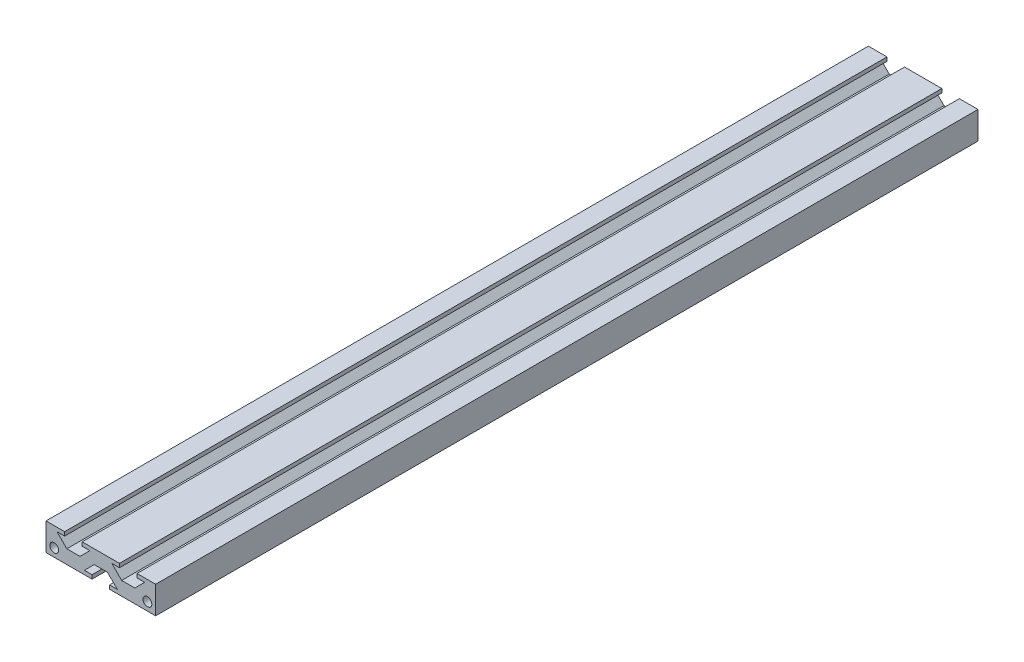
ISO-10303-21;
HEADER;
FILE_DESCRIPTION(('STEP AP214'),'2;1');
FILE_NAME('part.step','',(''),(''),'','','');
FILE_SCHEMA(('AUTOMOTIVE_DESIGN { 1 0 10303 214 1 1 1 1 }'));
ENDSEC;
DATA;
#1=APPLICATION_CONTEXT('core data for automotive mechanical design processes');
#2=APPLICATION_PROTOCOL_DEFINITION('international standard','automotive_design',2000,#1);
#3=PRODUCT_CONTEXT('',#1,'mechanical');
#4=PRODUCT('Part','Part','',(#3));
#5=PRODUCT_RELATED_PRODUCT_CATEGORY('part','',(#4));
#6=PRODUCT_DEFINITION_FORMATION('','',#4);
#7=PRODUCT_DEFINITION_CONTEXT('part definition',#1,'design');
#8=PRODUCT_DEFINITION('design','',#6,#7);
#9=PRODUCT_DEFINITION_SHAPE('','',#8);
#10=(LENGTH_UNIT() NAMED_UNIT(*) SI_UNIT(.MILLI.,.METRE.));
#11=(NAMED_UNIT(*) PLANE_ANGLE_UNIT() SI_UNIT($,.RADIAN.));
#12=(NAMED_UNIT(*) SI_UNIT($,.STERADIAN.) SOLID_ANGLE_UNIT());
#13=UNCERTAINTY_MEASURE_WITH_UNIT(LENGTH_MEASURE(1.E-05),#10,'distance_accuracy_value','');
#14=(GEOMETRIC_REPRESENTATION_CONTEXT(3) GLOBAL_UNCERTAINTY_ASSIGNED_CONTEXT((#13)) GLOBAL_UNIT_ASSIGNED_CONTEXT((#10,
#11,#12)) REPRESENTATION_CONTEXT('',''));
#15=CARTESIAN_POINT('',(0.,0.,0.));
#16=DIRECTION('',(0.,0.,1.));
#17=DIRECTION('',(1.,0.,0.));
#18=AXIS2_PLACEMENT_3D('',#15,#16,#17);
#19=CARTESIAN_POINT('',(0.,0.,300.));
#20=DIRECTION('',(0.,0.,1.));
#21=DIRECTION('',(1.,0.,0.));
#22=AXIS2_PLACEMENT_3D('',#19,#20,#21);
#23=PLANE('',#22);
#24=CARTESIAN_POINT('',(-17.,-2.,300.));
#25=DIRECTION('',(0.,0.,1.));
#26=DIRECTION('',(1.,0.,0.));
#27=AXIS2_PLACEMENT_3D('',#24,#25,#26);
#28=CIRCLE('',#27,1.6);
#29=CARTESIAN_POINT('',(-15.4,-2.,300.));
#30=VERTEX_POINT('',#29);
#31=EDGE_CURVE('E254',#30,#30,#28,.T.);
#32=ORIENTED_EDGE('',*,*,#31,.F.);
#33=EDGE_LOOP('',(#32));
#34=FACE_BOUND('',#33,.T.);
#35=DIRECTION('',(1.,0.,0.));
#36=VECTOR('',#35,1.);
#37=CARTESIAN_POINT('',(-3.20000000000001,-5.00000000000009,300.));
#38=LINE('',#37,#36);
#39=CARTESIAN_POINT('',(-20.,-5.,300.));
#40=VERTEX_POINT('',#39);
#41=CARTESIAN_POINT('',(-3.20000000000001,-5.00000000000009,300.));
#42=VERTEX_POINT('',#41);
#43=EDGE_CURVE('E305',#40,#42,#38,.T.);
#44=ORIENTED_EDGE('',*,*,#43,.T.);
#45=DIRECTION('',(0.,1.,0.));
#46=VECTOR('',#45,1.);
#47=CARTESIAN_POINT('',(-3.20000000000001,-3.60000000000005,300.));
#48=LINE('',#47,#46);
#49=CARTESIAN_POINT('',(-3.20000000000001,-3.60000000000005,300.));
#50=VERTEX_POINT('',#49);
#51=EDGE_CURVE('E153',#42,#50,#48,.T.);
#52=ORIENTED_EDGE('',*,*,#51,.T.);
#53=DIRECTION('',(-1.,0.,0.));
#54=VECTOR('',#53,1.);
#55=CARTESIAN_POINT('',(-6.00000000000008,-3.60000000000005,300.));
#56=LINE('',#55,#54);
#57=CARTESIAN_POINT('',(-6.00000000000008,-3.60000000000005,300.));
#58=VERTEX_POINT('',#57);
#59=EDGE_CURVE('E380',#50,#58,#56,.T.);
#60=ORIENTED_EDGE('',*,*,#59,.T.);
#61=DIRECTION('',(0.707106781186547,0.707106781186547,0.));
#62=VECTOR('',#61,1.);
#63=CARTESIAN_POINT('',(-2.40000000000002,0.,300.));
#64=LINE('',#63,#62);
#65=CARTESIAN_POINT('',(-2.40000000000002,0.,300.));
#66=VERTEX_POINT('',#65);
#67=EDGE_CURVE('E399',#58,#66,#64,.T.);
#68=ORIENTED_EDGE('',*,*,#67,.T.);
#69=DIRECTION('',(1.,0.,0.));
#70=VECTOR('',#69,1.);
#71=CARTESIAN_POINT('',(2.40000000000009,0.,300.));
#72=LINE('',#71,#70);
#73=CARTESIAN_POINT('',(2.40000000000009,0.,300.));
#74=VERTEX_POINT('',#73);
#75=EDGE_CURVE('E396',#66,#74,#72,.T.);
#76=ORIENTED_EDGE('',*,*,#75,.T.);
#77=DIRECTION('',(0.707106781186548,-0.707106781186548,0.));
#78=VECTOR('',#77,1.);
#79=CARTESIAN_POINT('',(6.0000000000001,-3.59999999999999,300.));
#80=LINE('',#79,#78);
#81=CARTESIAN_POINT('',(6.0000000000001,-3.59999999999999,300.));
#82=VERTEX_POINT('',#81);
#83=EDGE_CURVE('E398',#74,#82,#80,.T.);
#84=ORIENTED_EDGE('',*,*,#83,.T.);
#85=DIRECTION('',(-1.,0.,0.));
#86=VECTOR('',#85,1.);
#87=CARTESIAN_POINT('',(3.20000000000003,-3.59999999999999,300.));
#88=LINE('',#87,#86);
#89=CARTESIAN_POINT('',(3.20000000000003,-3.59999999999999,300.));
#90=VERTEX_POINT('',#89);
#91=EDGE_CURVE('E401',#82,#90,#88,.T.);
#92=ORIENTED_EDGE('',*,*,#91,.T.);
#93=DIRECTION('',(0.,-1.,0.));
#94=VECTOR('',#93,1.);
#95=CARTESIAN_POINT('',(3.20000000000003,-4.99999999999998,300.));
#96=LINE('',#95,#94);
#97=CARTESIAN_POINT('',(3.20000000000003,-4.99999999999998,300.));
#98=VERTEX_POINT('',#97);
#99=EDGE_CURVE('E407',#90,#98,#96,.T.);
#100=ORIENTED_EDGE('',*,*,#99,.T.);
#101=DIRECTION('',(1.,0.,0.));
#102=VECTOR('',#101,1.);
#103=CARTESIAN_POINT('',(20.,-5.,300.));
#104=LINE('',#103,#102);
#105=CARTESIAN_POINT('',(20.,-5.,300.));
#106=VERTEX_POINT('',#105);
#107=EDGE_CURVE('E409',#98,#106,#104,.T.);
#108=ORIENTED_EDGE('',*,*,#107,.T.);
#109=DIRECTION('',(0.,1.,0.));
#110=VECTOR('',#109,1.);
#111=CARTESIAN_POINT('',(20.,5.,300.));
#112=LINE('',#111,#110);
#113=CARTESIAN_POINT('',(20.,5.,300.));
#114=VERTEX_POINT('',#113);
#115=EDGE_CURVE('E411',#106,#114,#112,.T.);
#116=ORIENTED_EDGE('',*,*,#115,.T.);
#117=DIRECTION('',(-1.,0.,0.));
#118=VECTOR('',#117,1.);
#119=CARTESIAN_POINT('',(20.,5.,300.));
#120=LINE('',#119,#118);
#121=CARTESIAN_POINT('',(13.2,5.,300.));
#122=VERTEX_POINT('',#121);
#123=EDGE_CURVE('E413',#114,#122,#120,.T.);
#124=ORIENTED_EDGE('',*,*,#123,.T.);
#125=DIRECTION('',(0.,-1.,0.));
#126=VECTOR('',#125,1.);
#127=CARTESIAN_POINT('',(13.2,3.60000000000001,300.));
#128=LINE('',#127,#126);
#129=CARTESIAN_POINT('',(13.2,3.60000000000001,300.));
#130=VERTEX_POINT('',#129);
#131=EDGE_CURVE('E415',#122,#130,#128,.T.);
#132=ORIENTED_EDGE('',*,*,#131,.T.);
#133=DIRECTION('',(1.,0.,0.));
#134=VECTOR('',#133,1.);
#135=CARTESIAN_POINT('',(16.,3.6,300.));
#136=LINE('',#135,#134);
#137=CARTESIAN_POINT('',(16.,3.6,300.));
#138=VERTEX_POINT('',#137);
#139=EDGE_CURVE('E417',#130,#138,#136,.T.);
#140=ORIENTED_EDGE('',*,*,#139,.T.);
#141=DIRECTION('',(-0.707106781186543,-0.707106781186552,0.));
#142=VECTOR('',#141,1.);
#143=CARTESIAN_POINT('',(12.4,0.,300.));
#144=LINE('',#143,#142);
#145=CARTESIAN_POINT('',(12.4,0.,300.));
#146=VERTEX_POINT('',#145);
#147=EDGE_CURVE('E419',#138,#146,#144,.T.);
#148=ORIENTED_EDGE('',*,*,#147,.T.);
#149=DIRECTION('',(-1.,0.,0.));
#150=VECTOR('',#149,1.);
#151=CARTESIAN_POINT('',(7.59999999999999,0.,300.));
#152=LINE('',#151,#150);
#153=CARTESIAN_POINT('',(7.59999999999999,0.,300.));
#154=VERTEX_POINT('',#153);
#155=EDGE_CURVE('E421',#146,#154,#152,.T.);
#156=ORIENTED_EDGE('',*,*,#155,.T.);
#157=DIRECTION('',(-0.707106781186552,0.707106781186543,0.));
#158=VECTOR('',#157,1.);
#159=CARTESIAN_POINT('',(3.99999999999996,3.6,300.));
#160=LINE('',#159,#158);
#161=CARTESIAN_POINT('',(3.99999999999996,3.6,300.));
#162=VERTEX_POINT('',#161);
#163=EDGE_CURVE('E423',#154,#162,#160,.T.);
#164=ORIENTED_EDGE('',*,*,#163,.T.);
#165=DIRECTION('',(1.,0.,0.));
#166=VECTOR('',#165,1.);
#167=CARTESIAN_POINT('',(6.79999999999996,3.6,300.));
#168=LINE('',#167,#166);
#169=CARTESIAN_POINT('',(6.79999999999996,3.6,300.));
#170=VERTEX_POINT('',#169);
#171=EDGE_CURVE('E425',#162,#170,#168,.T.);
#172=ORIENTED_EDGE('',*,*,#171,.T.);
#173=DIRECTION('',(0.,1.,0.));
#174=VECTOR('',#173,1.);
#175=CARTESIAN_POINT('',(6.79999999999996,5.,300.));
#176=LINE('',#175,#174);
#177=CARTESIAN_POINT('',(6.79999999999996,5.,300.));
#178=VERTEX_POINT('',#177);
#179=EDGE_CURVE('E427',#170,#178,#176,.T.);
#180=ORIENTED_EDGE('',*,*,#179,.T.);
#181=DIRECTION('',(-1.,0.,0.));
#182=VECTOR('',#181,1.);
#183=CARTESIAN_POINT('',(6.79999999999996,5.,300.));
#184=LINE('',#183,#182);
#185=CARTESIAN_POINT('',(-6.80000000000005,5.,300.));
#186=VERTEX_POINT('',#185);
#187=EDGE_CURVE('E429',#178,#186,#184,.T.);
#188=ORIENTED_EDGE('',*,*,#187,.T.);
#189=DIRECTION('',(0.,-1.,0.));
#190=VECTOR('',#189,1.);
#191=CARTESIAN_POINT('',(-6.80000000000005,3.60000000000001,300.));
#192=LINE('',#191,#190);
#193=CARTESIAN_POINT('',(-6.80000000000005,3.60000000000001,300.));
#194=VERTEX_POINT('',#193);
#195=EDGE_CURVE('E431',#186,#194,#192,.T.);
#196=ORIENTED_EDGE('',*,*,#195,.T.);
#197=DIRECTION('',(1.,0.,0.));
#198=VECTOR('',#197,1.);
#199=CARTESIAN_POINT('',(-4.00000000000005,3.6,300.));
#200=LINE('',#199,#198);
#201=CARTESIAN_POINT('',(-4.00000000000005,3.6,300.));
#202=VERTEX_POINT('',#201);
#203=EDGE_CURVE('E433',#194,#202,#200,.T.);
#204=ORIENTED_EDGE('',*,*,#203,.T.);
#205=DIRECTION('',(-0.707106781186543,-0.707106781186552,0.));
#206=VECTOR('',#205,1.);
#207=CARTESIAN_POINT('',(-7.6,0.,300.));
#208=LINE('',#207,#206);
#209=CARTESIAN_POINT('',(-7.6,0.,300.));
#210=VERTEX_POINT('',#209);
#211=EDGE_CURVE('E435',#202,#210,#208,.T.);
#212=ORIENTED_EDGE('',*,*,#211,.T.);
#213=DIRECTION('',(-1.,0.,0.));
#214=VECTOR('',#213,1.);
#215=CARTESIAN_POINT('',(-12.4,0.,300.));
#216=LINE('',#215,#214);
#217=CARTESIAN_POINT('',(-12.4,0.,300.));
#218=VERTEX_POINT('',#217);
#219=EDGE_CURVE('E437',#210,#218,#216,.T.);
#220=ORIENTED_EDGE('',*,*,#219,.T.);
#221=DIRECTION('',(-0.707106781186551,0.707106781186544,0.));
#222=VECTOR('',#221,1.);
#223=CARTESIAN_POINT('',(-16.,3.6,300.));
#224=LINE('',#223,#222);
#225=CARTESIAN_POINT('',(-16.,3.6,300.));
#226=VERTEX_POINT('',#225);
#227=EDGE_CURVE('E439',#218,#226,#224,.T.);
#228=ORIENTED_EDGE('',*,*,#227,.T.);
#229=DIRECTION('',(1.,0.,0.));
#230=VECTOR('',#229,1.);
#231=CARTESIAN_POINT('',(-13.2,3.6,300.));
#232=LINE('',#231,#230);
#233=CARTESIAN_POINT('',(-13.2,3.6,300.));
#234=VERTEX_POINT('',#233);
#235=EDGE_CURVE('E232',#226,#234,#232,.T.);
#236=ORIENTED_EDGE('',*,*,#235,.T.);
#237=DIRECTION('',(0.,1.,0.));
#238=VECTOR('',#237,1.);
#239=CARTESIAN_POINT('',(-13.2,5.,300.));
#240=LINE('',#239,#238);
#241=CARTESIAN_POINT('',(-13.2,5.,300.));
#242=VERTEX_POINT('',#241);
#243=EDGE_CURVE('E226',#234,#242,#240,.T.);
#244=ORIENTED_EDGE('',*,*,#243,.T.);
#245=DIRECTION('',(-1.,0.,0.));
#246=VECTOR('',#245,1.);
#247=CARTESIAN_POINT('',(-13.2,5.,300.));
#248=LINE('',#247,#246);
#249=CARTESIAN_POINT('',(-20.,5.,300.));
#250=VERTEX_POINT('',#249);
#251=EDGE_CURVE('E230',#242,#250,#248,.T.);
#252=ORIENTED_EDGE('',*,*,#251,.T.);
#253=DIRECTION('',(0.,-1.,0.));
#254=VECTOR('',#253,1.);
#255=CARTESIAN_POINT('',(-20.,5.,300.));
#256=LINE('',#255,#254);
#257=EDGE_CURVE('E50',#250,#40,#256,.T.);
#258=ORIENTED_EDGE('',*,*,#257,.T.);
#259=EDGE_LOOP('',(#44,#52,#60,#68,#76,#84,#92,#100,#108,#116,#124,#132,#140,#148,#156,#164,
#172,#180,#188,#196,#204,#212,#220,#228,#236,#244,#252,#258));
#260=FACE_BOUND('',#259,.T.);
#261=CARTESIAN_POINT('',(17.,-2.,300.));
#262=DIRECTION('',(0.,0.,1.));
#263=DIRECTION('',(1.,0.,0.));
#264=AXIS2_PLACEMENT_3D('',#261,#262,#263);
#265=CIRCLE('',#264,1.60000000000001);
#266=CARTESIAN_POINT('',(18.6,-2.,300.));
#267=VERTEX_POINT('',#266);
#268=EDGE_CURVE('E481',#267,#267,#265,.T.);
#269=ORIENTED_EDGE('',*,*,#268,.F.);
#270=EDGE_LOOP('',(#269));
#271=FACE_BOUND('',#270,.T.);
#272=ADVANCED_FACE('F33',(#34,#260,#271),#23,.T.);
#273=CARTESIAN_POINT('',(0.,0.,0.));
#274=DIRECTION('',(0.,0.,1.));
#275=DIRECTION('',(1.,0.,0.));
#276=AXIS2_PLACEMENT_3D('',#273,#274,#275);
#277=PLANE('',#276);
#278=DIRECTION('',(1.,0.,0.));
#279=VECTOR('',#278,1.);
#280=CARTESIAN_POINT('',(-3.20000000000001,-5.00000000000009,0.));
#281=LINE('',#280,#279);
#282=CARTESIAN_POINT('',(-20.,-5.,0.));
#283=VERTEX_POINT('',#282);
#284=CARTESIAN_POINT('',(-3.20000000000001,-5.00000000000009,0.));
#285=VERTEX_POINT('',#284);
#286=EDGE_CURVE('E250',#283,#285,#281,.T.);
#287=ORIENTED_EDGE('',*,*,#286,.F.);
#288=DIRECTION('',(0.,-1.,0.));
#289=VECTOR('',#288,1.);
#290=CARTESIAN_POINT('',(-20.,5.,0.));
#291=LINE('',#290,#289);
#292=CARTESIAN_POINT('',(-20.,5.,0.));
#293=VERTEX_POINT('',#292);
#294=EDGE_CURVE('E145',#293,#283,#291,.T.);
#295=ORIENTED_EDGE('',*,*,#294,.F.);
#296=DIRECTION('',(-1.,0.,0.));
#297=VECTOR('',#296,1.);
#298=CARTESIAN_POINT('',(-13.2,5.,0.));
#299=LINE('',#298,#297);
#300=CARTESIAN_POINT('',(-13.2,5.,0.));
#301=VERTEX_POINT('',#300);
#302=EDGE_CURVE('E139',#301,#293,#299,.T.);
#303=ORIENTED_EDGE('',*,*,#302,.F.);
#304=DIRECTION('',(0.,1.,0.));
#305=VECTOR('',#304,1.);
#306=CARTESIAN_POINT('',(-13.2,5.,0.));
#307=LINE('',#306,#305);
#308=CARTESIAN_POINT('',(-13.2,3.6,0.));
#309=VERTEX_POINT('',#308);
#310=EDGE_CURVE('E240',#309,#301,#307,.T.);
#311=ORIENTED_EDGE('',*,*,#310,.F.);
#312=DIRECTION('',(1.,0.,0.));
#313=VECTOR('',#312,1.);
#314=CARTESIAN_POINT('',(-13.2,3.6,0.));
#315=LINE('',#314,#313);
#316=CARTESIAN_POINT('',(-16.,3.6,0.));
#317=VERTEX_POINT('',#316);
#318=EDGE_CURVE('E300',#317,#309,#315,.T.);
#319=ORIENTED_EDGE('',*,*,#318,.F.);
#320=DIRECTION('',(-0.707106781186551,0.707106781186544,0.));
#321=VECTOR('',#320,1.);
#322=CARTESIAN_POINT('',(-16.,3.6,0.));
#323=LINE('',#322,#321);
#324=CARTESIAN_POINT('',(-12.4,0.,0.));
#325=VERTEX_POINT('',#324);
#326=EDGE_CURVE('E298',#325,#317,#323,.T.);
#327=ORIENTED_EDGE('',*,*,#326,.F.);
#328=DIRECTION('',(-1.,0.,0.));
#329=VECTOR('',#328,1.);
#330=CARTESIAN_POINT('',(-12.4,0.,0.));
#331=LINE('',#330,#329);
#332=CARTESIAN_POINT('',(-7.6,0.,0.));
#333=VERTEX_POINT('',#332);
#334=EDGE_CURVE('E296',#333,#325,#331,.T.);
#335=ORIENTED_EDGE('',*,*,#334,.F.);
#336=DIRECTION('',(-0.707106781186543,-0.707106781186552,0.));
#337=VECTOR('',#336,1.);
#338=CARTESIAN_POINT('',(-7.6,0.,0.));
#339=LINE('',#338,#337);
#340=CARTESIAN_POINT('',(-4.00000000000005,3.6,0.));
#341=VERTEX_POINT('',#340);
#342=EDGE_CURVE('E294',#341,#333,#339,.T.);
#343=ORIENTED_EDGE('',*,*,#342,.F.);
#344=DIRECTION('',(1.,0.,0.));
#345=VECTOR('',#344,1.);
#346=CARTESIAN_POINT('',(-4.00000000000005,3.6,0.));
#347=LINE('',#346,#345);
#348=CARTESIAN_POINT('',(-6.80000000000005,3.60000000000001,0.));
#349=VERTEX_POINT('',#348);
#350=EDGE_CURVE('E292',#349,#341,#347,.T.);
#351=ORIENTED_EDGE('',*,*,#350,.F.);
#352=DIRECTION('',(0.,-1.,0.));
#353=VECTOR('',#352,1.);
#354=CARTESIAN_POINT('',(-6.80000000000005,3.60000000000001,0.));
#355=LINE('',#354,#353);
#356=CARTESIAN_POINT('',(-6.80000000000005,5.,0.));
#357=VERTEX_POINT('',#356);
#358=EDGE_CURVE('E290',#357,#349,#355,.T.);
#359=ORIENTED_EDGE('',*,*,#358,.F.);
#360=DIRECTION('',(-1.,0.,0.));
#361=VECTOR('',#360,1.);
#362=CARTESIAN_POINT('',(6.79999999999996,5.,0.));
#363=LINE('',#362,#361);
#364=CARTESIAN_POINT('',(6.79999999999996,5.,0.));
#365=VERTEX_POINT('',#364);
#366=EDGE_CURVE('E288',#365,#357,#363,.T.);
#367=ORIENTED_EDGE('',*,*,#366,.F.);
#368=DIRECTION('',(0.,1.,0.));
#369=VECTOR('',#368,1.);
#370=CARTESIAN_POINT('',(6.79999999999996,5.,0.));
#371=LINE('',#370,#369);
#372=CARTESIAN_POINT('',(6.79999999999996,3.6,0.));
#373=VERTEX_POINT('',#372);
#374=EDGE_CURVE('E286',#373,#365,#371,.T.);
#375=ORIENTED_EDGE('',*,*,#374,.F.);
#376=DIRECTION('',(1.,0.,0.));
#377=VECTOR('',#376,1.);
#378=CARTESIAN_POINT('',(6.79999999999996,3.6,0.));
#379=LINE('',#378,#377);
#380=CARTESIAN_POINT('',(3.99999999999996,3.6,0.));
#381=VERTEX_POINT('',#380);
#382=EDGE_CURVE('E284',#381,#373,#379,.T.);
#383=ORIENTED_EDGE('',*,*,#382,.F.);
#384=DIRECTION('',(-0.707106781186552,0.707106781186543,0.));
#385=VECTOR('',#384,1.);
#386=CARTESIAN_POINT('',(3.99999999999996,3.6,0.));
#387=LINE('',#386,#385);
#388=CARTESIAN_POINT('',(7.59999999999999,0.,0.));
#389=VERTEX_POINT('',#388);
#390=EDGE_CURVE('E282',#389,#381,#387,.T.);
#391=ORIENTED_EDGE('',*,*,#390,.F.);
#392=DIRECTION('',(-1.,0.,0.));
#393=VECTOR('',#392,1.);
#394=CARTESIAN_POINT('',(7.59999999999999,0.,0.));
#395=LINE('',#394,#393);
#396=CARTESIAN_POINT('',(12.4,0.,0.));
#397=VERTEX_POINT('',#396);
#398=EDGE_CURVE('E280',#397,#389,#395,.T.);
#399=ORIENTED_EDGE('',*,*,#398,.F.);
#400=DIRECTION('',(-0.707106781186543,-0.707106781186552,0.));
#401=VECTOR('',#400,1.);
#402=CARTESIAN_POINT('',(12.4,0.,0.));
#403=LINE('',#402,#401);
#404=CARTESIAN_POINT('',(16.,3.6,0.));
#405=VERTEX_POINT('',#404);
#406=EDGE_CURVE('E278',#405,#397,#403,.T.);
#407=ORIENTED_EDGE('',*,*,#406,.F.);
#408=DIRECTION('',(1.,0.,0.));
#409=VECTOR('',#408,1.);
#410=CARTESIAN_POINT('',(16.,3.6,0.));
#411=LINE('',#410,#409);
#412=CARTESIAN_POINT('',(13.2,3.60000000000001,0.));
#413=VERTEX_POINT('',#412);
#414=EDGE_CURVE('E276',#413,#405,#411,.T.);
#415=ORIENTED_EDGE('',*,*,#414,.F.);
#416=DIRECTION('',(0.,-1.,0.));
#417=VECTOR('',#416,1.);
#418=CARTESIAN_POINT('',(13.2,3.60000000000001,0.));
#419=LINE('',#418,#417);
#420=CARTESIAN_POINT('',(13.2,5.,0.));
#421=VERTEX_POINT('',#420);
#422=EDGE_CURVE('E274',#421,#413,#419,.T.);
#423=ORIENTED_EDGE('',*,*,#422,.F.);
#424=DIRECTION('',(-1.,0.,0.));
#425=VECTOR('',#424,1.);
#426=CARTESIAN_POINT('',(20.,5.,0.));
#427=LINE('',#426,#425);
#428=CARTESIAN_POINT('',(20.,5.,0.));
#429=VERTEX_POINT('',#428);
#430=EDGE_CURVE('E272',#429,#421,#427,.T.);
#431=ORIENTED_EDGE('',*,*,#430,.F.);
#432=DIRECTION('',(0.,1.,0.));
#433=VECTOR('',#432,1.);
#434=CARTESIAN_POINT('',(20.,5.,0.));
#435=LINE('',#434,#433);
#436=CARTESIAN_POINT('',(20.,-5.,0.));
#437=VERTEX_POINT('',#436);
#438=EDGE_CURVE('E270',#437,#429,#435,.T.);
#439=ORIENTED_EDGE('',*,*,#438,.F.);
#440=DIRECTION('',(1.,0.,0.));
#441=VECTOR('',#440,1.);
#442=CARTESIAN_POINT('',(20.,-5.,0.));
#443=LINE('',#442,#441);
#444=CARTESIAN_POINT('',(3.20000000000003,-4.99999999999998,0.));
#445=VERTEX_POINT('',#444);
#446=EDGE_CURVE('E268',#445,#437,#443,.T.);
#447=ORIENTED_EDGE('',*,*,#446,.F.);
#448=DIRECTION('',(0.,-1.,0.));
#449=VECTOR('',#448,1.);
#450=CARTESIAN_POINT('',(3.20000000000003,-4.99999999999998,0.));
#451=LINE('',#450,#449);
#452=CARTESIAN_POINT('',(3.20000000000003,-3.59999999999999,0.));
#453=VERTEX_POINT('',#452);
#454=EDGE_CURVE('E266',#453,#445,#451,.T.);
#455=ORIENTED_EDGE('',*,*,#454,.F.);
#456=DIRECTION('',(-1.,0.,0.));
#457=VECTOR('',#456,1.);
#458=CARTESIAN_POINT('',(3.20000000000003,-3.59999999999999,0.));
#459=LINE('',#458,#457);
#460=CARTESIAN_POINT('',(6.0000000000001,-3.59999999999999,0.));
#461=VERTEX_POINT('',#460);
#462=EDGE_CURVE('E264',#461,#453,#459,.T.);
#463=ORIENTED_EDGE('',*,*,#462,.F.);
#464=DIRECTION('',(0.707106781186548,-0.707106781186548,0.));
#465=VECTOR('',#464,1.);
#466=CARTESIAN_POINT('',(6.0000000000001,-3.59999999999999,0.));
#467=LINE('',#466,#465);
#468=CARTESIAN_POINT('',(2.40000000000009,0.,0.));
#469=VERTEX_POINT('',#468);
#470=EDGE_CURVE('E262',#469,#461,#467,.T.);
#471=ORIENTED_EDGE('',*,*,#470,.F.);
#472=DIRECTION('',(1.,0.,0.));
#473=VECTOR('',#472,1.);
#474=CARTESIAN_POINT('',(2.40000000000009,0.,0.));
#475=LINE('',#474,#473);
#476=CARTESIAN_POINT('',(-2.40000000000002,0.,0.));
#477=VERTEX_POINT('',#476);
#478=EDGE_CURVE('E260',#477,#469,#475,.T.);
#479=ORIENTED_EDGE('',*,*,#478,.F.);
#480=DIRECTION('',(0.707106781186547,0.707106781186547,0.));
#481=VECTOR('',#480,1.);
#482=CARTESIAN_POINT('',(-2.40000000000002,0.,0.));
#483=LINE('',#482,#481);
#484=CARTESIAN_POINT('',(-6.00000000000008,-3.60000000000005,0.));
#485=VERTEX_POINT('',#484);
#486=EDGE_CURVE('E258',#485,#477,#483,.T.);
#487=ORIENTED_EDGE('',*,*,#486,.F.);
#488=DIRECTION('',(-1.,0.,0.));
#489=VECTOR('',#488,1.);
#490=CARTESIAN_POINT('',(-6.00000000000008,-3.60000000000005,0.));
#491=LINE('',#490,#489);
#492=CARTESIAN_POINT('',(-3.20000000000001,-3.60000000000005,0.));
#493=VERTEX_POINT('',#492);
#494=EDGE_CURVE('E256',#493,#485,#491,.T.);
#495=ORIENTED_EDGE('',*,*,#494,.F.);
#496=DIRECTION('',(0.,1.,0.));
#497=VECTOR('',#496,1.);
#498=CARTESIAN_POINT('',(-3.20000000000001,-3.60000000000005,0.));
#499=LINE('',#498,#497);
#500=EDGE_CURVE('E253',#285,#493,#499,.T.);
#501=ORIENTED_EDGE('',*,*,#500,.F.);
#502=EDGE_LOOP('',(#287,#295,#303,#311,#319,#327,#335,#343,#351,#359,#367,#375,#383,#391,#399,
#407,#415,#423,#431,#439,#447,#455,#463,#471,#479,#487,#495,#501));
#503=FACE_BOUND('',#502,.T.);
#504=CARTESIAN_POINT('',(-17.,-2.,0.));
#505=DIRECTION('',(0.,0.,1.));
#506=DIRECTION('',(1.,0.,0.));
#507=AXIS2_PLACEMENT_3D('',#504,#505,#506);
#508=CIRCLE('',#507,1.6);
#509=CARTESIAN_POINT('',(-15.4,-2.,0.));
#510=VERTEX_POINT('',#509);
#511=EDGE_CURVE('E487',#510,#510,#508,.T.);
#512=ORIENTED_EDGE('',*,*,#511,.T.);
#513=EDGE_LOOP('',(#512));
#514=FACE_BOUND('',#513,.T.);
#515=CARTESIAN_POINT('',(17.,-2.,0.));
#516=DIRECTION('',(0.,0.,1.));
#517=DIRECTION('',(1.,0.,0.));
#518=AXIS2_PLACEMENT_3D('',#515,#516,#517);
#519=CIRCLE('',#518,1.60000000000001);
#520=CARTESIAN_POINT('',(18.6,-2.,0.));
#521=VERTEX_POINT('',#520);
#522=EDGE_CURVE('E484',#521,#521,#519,.T.);
#523=ORIENTED_EDGE('',*,*,#522,.T.);
#524=EDGE_LOOP('',(#523));
#525=FACE_BOUND('',#524,.T.);
#526=ADVANCED_FACE('F384',(#503,#514,#525),#277,.F.);
#527=CARTESIAN_POINT('',(-3.20000000000001,-5.00000000000009,300.));
#528=DIRECTION('',(0.,1.,0.));
#529=DIRECTION('',(-1.,0.,0.));
#530=AXIS2_PLACEMENT_3D('',#527,#528,#529);
#531=PLANE('',#530);
#532=ORIENTED_EDGE('',*,*,#286,.T.);
#533=DIRECTION('',(0.,0.,-1.));
#534=VECTOR('',#533,1.);
#535=CARTESIAN_POINT('',(-3.20000000000001,-5.00000000000009,300.));
#536=LINE('',#535,#534);
#537=EDGE_CURVE('E11',#42,#285,#536,.T.);
#538=ORIENTED_EDGE('',*,*,#537,.F.);
#539=ORIENTED_EDGE('',*,*,#43,.F.);
#540=DIRECTION('',(0.,0.,-1.));
#541=VECTOR('',#540,1.);
#542=CARTESIAN_POINT('',(-20.,-5.,300.));
#543=LINE('',#542,#541);
#544=EDGE_CURVE('E246',#40,#283,#543,.T.);
#545=ORIENTED_EDGE('',*,*,#544,.T.);
#546=EDGE_LOOP('',(#532,#538,#539,#545));
#547=FACE_BOUND('',#546,.T.);
#548=ADVANCED_FACE('F35',(#547),#531,.F.);
#549=CARTESIAN_POINT('',(-3.20000000000001,-3.60000000000005,300.));
#550=DIRECTION('',(-1.,0.,0.));
#551=DIRECTION('',(0.,0.,1.));
#552=AXIS2_PLACEMENT_3D('',#549,#550,#551);
#553=PLANE('',#552);
#554=ORIENTED_EDGE('',*,*,#500,.T.);
#555=DIRECTION('',(0.,0.,-1.));
#556=VECTOR('',#555,1.);
#557=CARTESIAN_POINT('',(-3.20000000000001,-3.60000000000005,300.));
#558=LINE('',#557,#556);
#559=EDGE_CURVE('E42',#50,#493,#558,.T.);
#560=ORIENTED_EDGE('',*,*,#559,.F.);
#561=ORIENTED_EDGE('',*,*,#51,.F.);
#562=ORIENTED_EDGE('',*,*,#537,.T.);
#563=EDGE_LOOP('',(#554,#560,#561,#562));
#564=FACE_BOUND('',#563,.T.);
#565=ADVANCED_FACE('F740',(#564),#553,.F.);
#566=CARTESIAN_POINT('',(-6.00000000000008,-3.60000000000005,300.));
#567=DIRECTION('',(0.,-1.,0.));
#568=DIRECTION('',(0.,0.,-1.));
#569=AXIS2_PLACEMENT_3D('',#566,#567,#568);
#570=PLANE('',#569);
#571=ORIENTED_EDGE('',*,*,#494,.T.);
#572=DIRECTION('',(0.,0.,-1.));
#573=VECTOR('',#572,1.);
#574=CARTESIAN_POINT('',(-6.00000000000008,-3.60000000000005,300.));
#575=LINE('',#574,#573);
#576=EDGE_CURVE('E372',#58,#485,#575,.T.);
#577=ORIENTED_EDGE('',*,*,#576,.F.);
#578=ORIENTED_EDGE('',*,*,#59,.F.);
#579=ORIENTED_EDGE('',*,*,#559,.T.);
#580=EDGE_LOOP('',(#571,#577,#578,#579));
#581=FACE_BOUND('',#580,.T.);
#582=ADVANCED_FACE('F378',(#581),#570,.F.);
#583=CARTESIAN_POINT('',(-2.40000000000002,0.,300.));
#584=DIRECTION('',(-0.707106781186548,0.707106781186548,0.));
#585=DIRECTION('',(-0.707106781186548,-0.707106781186548,0.));
#586=AXIS2_PLACEMENT_3D('',#583,#584,#585);
#587=PLANE('',#586);
#588=ORIENTED_EDGE('',*,*,#486,.T.);
#589=DIRECTION('',(0.,0.,-1.));
#590=VECTOR('',#589,1.);
#591=CARTESIAN_POINT('',(-2.40000000000002,0.,300.));
#592=LINE('',#591,#590);
#593=EDGE_CURVE('E369',#66,#477,#592,.T.);
#594=ORIENTED_EDGE('',*,*,#593,.F.);
#595=ORIENTED_EDGE('',*,*,#67,.F.);
#596=ORIENTED_EDGE('',*,*,#576,.T.);
#597=EDGE_LOOP('',(#588,#594,#595,#596));
#598=FACE_BOUND('',#597,.T.);
#599=ADVANCED_FACE('F390',(#598),#587,.F.);
#600=CARTESIAN_POINT('',(2.40000000000009,0.,300.));
#601=DIRECTION('',(0.,1.,0.));
#602=DIRECTION('',(0.,0.,1.));
#603=AXIS2_PLACEMENT_3D('',#600,#601,#602);
#604=PLANE('',#603);
#605=ORIENTED_EDGE('',*,*,#478,.T.);
#606=DIRECTION('',(0.,0.,-1.));
#607=VECTOR('',#606,1.);
#608=CARTESIAN_POINT('',(2.40000000000009,0.,300.));
#609=LINE('',#608,#607);
#610=EDGE_CURVE('E366',#74,#469,#609,.T.);
#611=ORIENTED_EDGE('',*,*,#610,.F.);
#612=ORIENTED_EDGE('',*,*,#75,.F.);
#613=ORIENTED_EDGE('',*,*,#593,.T.);
#614=EDGE_LOOP('',(#605,#611,#612,#613));
#615=FACE_BOUND('',#614,.T.);
#616=ADVANCED_FACE('F394',(#615),#604,.F.);
#617=CARTESIAN_POINT('',(6.0000000000001,-3.59999999999999,300.));
#618=DIRECTION('',(0.707106781186548,0.707106781186548,0.));
#619=DIRECTION('',(-0.707106781186548,0.707106781186548,0.));
#620=AXIS2_PLACEMENT_3D('',#617,#618,#619);
#621=PLANE('',#620);
#622=ORIENTED_EDGE('',*,*,#470,.T.);
#623=DIRECTION('',(0.,0.,-1.));
#624=VECTOR('',#623,1.);
#625=CARTESIAN_POINT('',(6.0000000000001,-3.59999999999999,300.));
#626=LINE('',#625,#624);
#627=EDGE_CURVE('E363',#82,#461,#626,.T.);
#628=ORIENTED_EDGE('',*,*,#627,.F.);
#629=ORIENTED_EDGE('',*,*,#83,.F.);
#630=ORIENTED_EDGE('',*,*,#610,.T.);
#631=EDGE_LOOP('',(#622,#628,#629,#630));
#632=FACE_BOUND('',#631,.T.);
#633=ADVANCED_FACE('F705',(#632),#621,.F.);
#634=CARTESIAN_POINT('',(3.20000000000003,-3.59999999999999,300.));
#635=DIRECTION('',(0.,-1.,0.));
#636=DIRECTION('',(0.,0.,-1.));
#637=AXIS2_PLACEMENT_3D('',#634,#635,#636);
#638=PLANE('',#637);
#639=ORIENTED_EDGE('',*,*,#462,.T.);
#640=DIRECTION('',(0.,0.,-1.));
#641=VECTOR('',#640,1.);
#642=CARTESIAN_POINT('',(3.20000000000003,-3.59999999999999,300.));
#643=LINE('',#642,#641);
#644=EDGE_CURVE('E360',#90,#453,#643,.T.);
#645=ORIENTED_EDGE('',*,*,#644,.F.);
#646=ORIENTED_EDGE('',*,*,#91,.F.);
#647=ORIENTED_EDGE('',*,*,#627,.T.);
#648=EDGE_LOOP('',(#639,#645,#646,#647));
#649=FACE_BOUND('',#648,.T.);
#650=ADVANCED_FACE('F695',(#649),#638,.F.);
#651=CARTESIAN_POINT('',(3.20000000000003,-4.99999999999998,300.));
#652=DIRECTION('',(1.,0.,0.));
#653=DIRECTION('',(0.,0.,-1.));
#654=AXIS2_PLACEMENT_3D('',#651,#652,#653);
#655=PLANE('',#654);
#656=ORIENTED_EDGE('',*,*,#454,.T.);
#657=DIRECTION('',(0.,0.,-1.));
#658=VECTOR('',#657,1.);
#659=CARTESIAN_POINT('',(3.20000000000003,-4.99999999999998,300.));
#660=LINE('',#659,#658);
#661=EDGE_CURVE('E357',#98,#445,#660,.T.);
#662=ORIENTED_EDGE('',*,*,#661,.F.);
#663=ORIENTED_EDGE('',*,*,#99,.F.);
#664=ORIENTED_EDGE('',*,*,#644,.T.);
#665=EDGE_LOOP('',(#656,#662,#663,#664));
#666=FACE_BOUND('',#665,.T.);
#667=ADVANCED_FACE('F685',(#666),#655,.F.);
#668=CARTESIAN_POINT('',(20.,-5.,300.));
#669=DIRECTION('',(0.,1.,0.));
#670=DIRECTION('',(-1.,0.,0.));
#671=AXIS2_PLACEMENT_3D('',#668,#669,#670);
#672=PLANE('',#671);
#673=ORIENTED_EDGE('',*,*,#446,.T.);
#674=DIRECTION('',(0.,0.,-1.));
#675=VECTOR('',#674,1.);
#676=CARTESIAN_POINT('',(20.,-5.,300.));
#677=LINE('',#676,#675);
#678=EDGE_CURVE('E354',#106,#437,#677,.T.);
#679=ORIENTED_EDGE('',*,*,#678,.F.);
#680=ORIENTED_EDGE('',*,*,#107,.F.);
#681=ORIENTED_EDGE('',*,*,#661,.T.);
#682=EDGE_LOOP('',(#673,#679,#680,#681));
#683=FACE_BOUND('',#682,.T.);
#684=ADVANCED_FACE('F675',(#683),#672,.F.);
#685=CARTESIAN_POINT('',(20.,5.,300.));
#686=DIRECTION('',(-1.,0.,0.));
#687=DIRECTION('',(0.,0.,1.));
#688=AXIS2_PLACEMENT_3D('',#685,#686,#687);
#689=PLANE('',#688);
#690=ORIENTED_EDGE('',*,*,#438,.T.);
#691=DIRECTION('',(0.,0.,-1.));
#692=VECTOR('',#691,1.);
#693=CARTESIAN_POINT('',(20.,5.,300.));
#694=LINE('',#693,#692);
#695=EDGE_CURVE('E351',#114,#429,#694,.T.);
#696=ORIENTED_EDGE('',*,*,#695,.F.);
#697=ORIENTED_EDGE('',*,*,#115,.F.);
#698=ORIENTED_EDGE('',*,*,#678,.T.);
#699=EDGE_LOOP('',(#690,#696,#697,#698));
#700=FACE_BOUND('',#699,.T.);
#701=ADVANCED_FACE('F665',(#700),#689,.F.);
#702=CARTESIAN_POINT('',(20.,5.,300.));
#703=DIRECTION('',(0.,-1.,0.));
#704=DIRECTION('',(1.,0.,0.));
#705=AXIS2_PLACEMENT_3D('',#702,#703,#704);
#706=PLANE('',#705);
#707=ORIENTED_EDGE('',*,*,#430,.T.);
#708=DIRECTION('',(0.,0.,-1.));
#709=VECTOR('',#708,1.);
#710=CARTESIAN_POINT('',(13.2,5.,300.));
#711=LINE('',#710,#709);
#712=EDGE_CURVE('E348',#122,#421,#711,.T.);
#713=ORIENTED_EDGE('',*,*,#712,.F.);
#714=ORIENTED_EDGE('',*,*,#123,.F.);
#715=ORIENTED_EDGE('',*,*,#695,.T.);
#716=EDGE_LOOP('',(#707,#713,#714,#715));
#717=FACE_BOUND('',#716,.T.);
#718=ADVANCED_FACE('F655',(#717),#706,.F.);
#719=CARTESIAN_POINT('',(13.2,3.60000000000001,300.));
#720=DIRECTION('',(1.,0.,0.));
#721=DIRECTION('',(0.,0.,-1.));
#722=AXIS2_PLACEMENT_3D('',#719,#720,#721);
#723=PLANE('',#722);
#724=ORIENTED_EDGE('',*,*,#422,.T.);
#725=DIRECTION('',(0.,0.,-1.));
#726=VECTOR('',#725,1.);
#727=CARTESIAN_POINT('',(13.2,3.60000000000001,300.));
#728=LINE('',#727,#726);
#729=EDGE_CURVE('E345',#130,#413,#728,.T.);
#730=ORIENTED_EDGE('',*,*,#729,.F.);
#731=ORIENTED_EDGE('',*,*,#131,.F.);
#732=ORIENTED_EDGE('',*,*,#712,.T.);
#733=EDGE_LOOP('',(#724,#730,#731,#732));
#734=FACE_BOUND('',#733,.T.);
#735=ADVANCED_FACE('F645',(#734),#723,.F.);
#736=CARTESIAN_POINT('',(16.,3.6,300.));
#737=DIRECTION('',(0.,1.,0.));
#738=DIRECTION('',(-1.,0.,0.));
#739=AXIS2_PLACEMENT_3D('',#736,#737,#738);
#740=PLANE('',#739);
#741=ORIENTED_EDGE('',*,*,#414,.T.);
#742=DIRECTION('',(0.,0.,-1.));
#743=VECTOR('',#742,1.);
#744=CARTESIAN_POINT('',(16.,3.6,300.));
#745=LINE('',#744,#743);
#746=EDGE_CURVE('E342',#138,#405,#745,.T.);
#747=ORIENTED_EDGE('',*,*,#746,.F.);
#748=ORIENTED_EDGE('',*,*,#139,.F.);
#749=ORIENTED_EDGE('',*,*,#729,.T.);
#750=EDGE_LOOP('',(#741,#747,#748,#749));
#751=FACE_BOUND('',#750,.T.);
#752=ADVANCED_FACE('F635',(#751),#740,.F.);
#753=CARTESIAN_POINT('',(12.4,0.,300.));
#754=DIRECTION('',(0.707106781186552,-0.707106781186543,0.));
#755=DIRECTION('',(0.707106781186543,0.707106781186552,0.));
#756=AXIS2_PLACEMENT_3D('',#753,#754,#755);
#757=PLANE('',#756);
#758=ORIENTED_EDGE('',*,*,#406,.T.);
#759=DIRECTION('',(0.,0.,-1.));
#760=VECTOR('',#759,1.);
#761=CARTESIAN_POINT('',(12.4,0.,300.));
#762=LINE('',#761,#760);
#763=EDGE_CURVE('E339',#146,#397,#762,.T.);
#764=ORIENTED_EDGE('',*,*,#763,.F.);
#765=ORIENTED_EDGE('',*,*,#147,.F.);
#766=ORIENTED_EDGE('',*,*,#746,.T.);
#767=EDGE_LOOP('',(#758,#764,#765,#766));
#768=FACE_BOUND('',#767,.T.);
#769=ADVANCED_FACE('F625',(#768),#757,.F.);
#770=CARTESIAN_POINT('',(7.59999999999999,0.,300.));
#771=DIRECTION('',(0.,-1.,0.));
#772=DIRECTION('',(1.,0.,0.));
#773=AXIS2_PLACEMENT_3D('',#770,#771,#772);
#774=PLANE('',#773);
#775=ORIENTED_EDGE('',*,*,#398,.T.);
#776=DIRECTION('',(0.,0.,-1.));
#777=VECTOR('',#776,1.);
#778=CARTESIAN_POINT('',(7.59999999999999,0.,300.));
#779=LINE('',#778,#777);
#780=EDGE_CURVE('E336',#154,#389,#779,.T.);
#781=ORIENTED_EDGE('',*,*,#780,.F.);
#782=ORIENTED_EDGE('',*,*,#155,.F.);
#783=ORIENTED_EDGE('',*,*,#763,.T.);
#784=EDGE_LOOP('',(#775,#781,#782,#783));
#785=FACE_BOUND('',#784,.T.);
#786=ADVANCED_FACE('F615',(#785),#774,.F.);
#787=CARTESIAN_POINT('',(3.99999999999996,3.6,300.));
#788=DIRECTION('',(-0.707106781186543,-0.707106781186552,0.));
#789=DIRECTION('',(0.707106781186552,-0.707106781186543,0.));
#790=AXIS2_PLACEMENT_3D('',#787,#788,#789);
#791=PLANE('',#790);
#792=ORIENTED_EDGE('',*,*,#390,.T.);
#793=DIRECTION('',(0.,0.,-1.));
#794=VECTOR('',#793,1.);
#795=CARTESIAN_POINT('',(3.99999999999996,3.6,300.));
#796=LINE('',#795,#794);
#797=EDGE_CURVE('E333',#162,#381,#796,.T.);
#798=ORIENTED_EDGE('',*,*,#797,.F.);
#799=ORIENTED_EDGE('',*,*,#163,.F.);
#800=ORIENTED_EDGE('',*,*,#780,.T.);
#801=EDGE_LOOP('',(#792,#798,#799,#800));
#802=FACE_BOUND('',#801,.T.);
#803=ADVANCED_FACE('F605',(#802),#791,.F.);
#804=CARTESIAN_POINT('',(6.79999999999996,3.6,300.));
#805=DIRECTION('',(0.,1.,0.));
#806=DIRECTION('',(0.,0.,1.));
#807=AXIS2_PLACEMENT_3D('',#804,#805,#806);
#808=PLANE('',#807);
#809=ORIENTED_EDGE('',*,*,#382,.T.);
#810=DIRECTION('',(0.,0.,-1.));
#811=VECTOR('',#810,1.);
#812=CARTESIAN_POINT('',(6.79999999999996,3.6,300.));
#813=LINE('',#812,#811);
#814=EDGE_CURVE('E330',#170,#373,#813,.T.);
#815=ORIENTED_EDGE('',*,*,#814,.F.);
#816=ORIENTED_EDGE('',*,*,#171,.F.);
#817=ORIENTED_EDGE('',*,*,#797,.T.);
#818=EDGE_LOOP('',(#809,#815,#816,#817));
#819=FACE_BOUND('',#818,.T.);
#820=ADVANCED_FACE('F595',(#819),#808,.F.);
#821=CARTESIAN_POINT('',(6.79999999999996,5.,300.));
#822=DIRECTION('',(-1.,0.,0.));
#823=DIRECTION('',(0.,0.,1.));
#824=AXIS2_PLACEMENT_3D('',#821,#822,#823);
#825=PLANE('',#824);
#826=ORIENTED_EDGE('',*,*,#374,.T.);
#827=DIRECTION('',(0.,0.,-1.));
#828=VECTOR('',#827,1.);
#829=CARTESIAN_POINT('',(6.79999999999996,5.,300.));
#830=LINE('',#829,#828);
#831=EDGE_CURVE('E327',#178,#365,#830,.T.);
#832=ORIENTED_EDGE('',*,*,#831,.F.);
#833=ORIENTED_EDGE('',*,*,#179,.F.);
#834=ORIENTED_EDGE('',*,*,#814,.T.);
#835=EDGE_LOOP('',(#826,#832,#833,#834));
#836=FACE_BOUND('',#835,.T.);
#837=ADVANCED_FACE('F585',(#836),#825,.F.);
#838=CARTESIAN_POINT('',(6.79999999999996,5.,300.));
#839=DIRECTION('',(0.,-1.,0.));
#840=DIRECTION('',(1.,0.,0.));
#841=AXIS2_PLACEMENT_3D('',#838,#839,#840);
#842=PLANE('',#841);
#843=ORIENTED_EDGE('',*,*,#366,.T.);
#844=DIRECTION('',(0.,0.,-1.));
#845=VECTOR('',#844,1.);
#846=CARTESIAN_POINT('',(-6.80000000000005,5.,300.));
#847=LINE('',#846,#845);
#848=EDGE_CURVE('E324',#186,#357,#847,.T.);
#849=ORIENTED_EDGE('',*,*,#848,.F.);
#850=ORIENTED_EDGE('',*,*,#187,.F.);
#851=ORIENTED_EDGE('',*,*,#831,.T.);
#852=EDGE_LOOP('',(#843,#849,#850,#851));
#853=FACE_BOUND('',#852,.T.);
#854=ADVANCED_FACE('F575',(#853),#842,.F.);
#855=CARTESIAN_POINT('',(-6.80000000000005,3.60000000000001,300.));
#856=DIRECTION('',(1.,0.,0.));
#857=DIRECTION('',(0.,0.,-1.));
#858=AXIS2_PLACEMENT_3D('',#855,#856,#857);
#859=PLANE('',#858);
#860=ORIENTED_EDGE('',*,*,#358,.T.);
#861=DIRECTION('',(0.,0.,-1.));
#862=VECTOR('',#861,1.);
#863=CARTESIAN_POINT('',(-6.80000000000005,3.60000000000001,300.));
#864=LINE('',#863,#862);
#865=EDGE_CURVE('E321',#194,#349,#864,.T.);
#866=ORIENTED_EDGE('',*,*,#865,.F.);
#867=ORIENTED_EDGE('',*,*,#195,.F.);
#868=ORIENTED_EDGE('',*,*,#848,.T.);
#869=EDGE_LOOP('',(#860,#866,#867,#868));
#870=FACE_BOUND('',#869,.T.);
#871=ADVANCED_FACE('F565',(#870),#859,.F.);
#872=CARTESIAN_POINT('',(-4.00000000000005,3.6,300.));
#873=DIRECTION('',(0.,1.,0.));
#874=DIRECTION('',(-1.,0.,0.));
#875=AXIS2_PLACEMENT_3D('',#872,#873,#874);
#876=PLANE('',#875);
#877=ORIENTED_EDGE('',*,*,#350,.T.);
#878=DIRECTION('',(0.,0.,-1.));
#879=VECTOR('',#878,1.);
#880=CARTESIAN_POINT('',(-4.00000000000005,3.6,300.));
#881=LINE('',#880,#879);
#882=EDGE_CURVE('E318',#202,#341,#881,.T.);
#883=ORIENTED_EDGE('',*,*,#882,.F.);
#884=ORIENTED_EDGE('',*,*,#203,.F.);
#885=ORIENTED_EDGE('',*,*,#865,.T.);
#886=EDGE_LOOP('',(#877,#883,#884,#885));
#887=FACE_BOUND('',#886,.T.);
#888=ADVANCED_FACE('F555',(#887),#876,.F.);
#889=CARTESIAN_POINT('',(-7.6,0.,300.));
#890=DIRECTION('',(0.707106781186552,-0.707106781186543,0.));
#891=DIRECTION('',(0.707106781186543,0.707106781186552,0.));
#892=AXIS2_PLACEMENT_3D('',#889,#890,#891);
#893=PLANE('',#892);
#894=ORIENTED_EDGE('',*,*,#342,.T.);
#895=DIRECTION('',(0.,0.,-1.));
#896=VECTOR('',#895,1.);
#897=CARTESIAN_POINT('',(-7.6,0.,300.));
#898=LINE('',#897,#896);
#899=EDGE_CURVE('E315',#210,#333,#898,.T.);
#900=ORIENTED_EDGE('',*,*,#899,.F.);
#901=ORIENTED_EDGE('',*,*,#211,.F.);
#902=ORIENTED_EDGE('',*,*,#882,.T.);
#903=EDGE_LOOP('',(#894,#900,#901,#902));
#904=FACE_BOUND('',#903,.T.);
#905=ADVANCED_FACE('F545',(#904),#893,.F.);
#906=CARTESIAN_POINT('',(-12.4,0.,300.));
#907=DIRECTION('',(0.,-1.,0.));
#908=DIRECTION('',(1.,0.,0.));
#909=AXIS2_PLACEMENT_3D('',#906,#907,#908);
#910=PLANE('',#909);
#911=ORIENTED_EDGE('',*,*,#334,.T.);
#912=DIRECTION('',(0.,0.,-1.));
#913=VECTOR('',#912,1.);
#914=CARTESIAN_POINT('',(-12.4,0.,300.));
#915=LINE('',#914,#913);
#916=EDGE_CURVE('E312',#218,#325,#915,.T.);
#917=ORIENTED_EDGE('',*,*,#916,.F.);
#918=ORIENTED_EDGE('',*,*,#219,.F.);
#919=ORIENTED_EDGE('',*,*,#899,.T.);
#920=EDGE_LOOP('',(#911,#917,#918,#919));
#921=FACE_BOUND('',#920,.T.);
#922=ADVANCED_FACE('F536',(#921),#910,.F.);
#923=CARTESIAN_POINT('',(-16.,3.6,300.));
#924=DIRECTION('',(-0.707106781186544,-0.707106781186551,0.));
#925=DIRECTION('',(0.707106781186551,-0.707106781186544,0.));
#926=AXIS2_PLACEMENT_3D('',#923,#924,#925);
#927=PLANE('',#926);
#928=ORIENTED_EDGE('',*,*,#326,.T.);
#929=DIRECTION('',(0.,0.,-1.));
#930=VECTOR('',#929,1.);
#931=CARTESIAN_POINT('',(-16.,3.6,300.));
#932=LINE('',#931,#930);
#933=EDGE_CURVE('E309',#226,#317,#932,.T.);
#934=ORIENTED_EDGE('',*,*,#933,.F.);
#935=ORIENTED_EDGE('',*,*,#227,.F.);
#936=ORIENTED_EDGE('',*,*,#916,.T.);
#937=EDGE_LOOP('',(#928,#934,#935,#936));
#938=FACE_BOUND('',#937,.T.);
#939=ADVANCED_FACE('F445',(#938),#927,.F.);
#940=CARTESIAN_POINT('',(-13.2,3.6,300.));
#941=DIRECTION('',(0.,1.,0.));
#942=DIRECTION('',(0.,0.,1.));
#943=AXIS2_PLACEMENT_3D('',#940,#941,#942);
#944=PLANE('',#943);
#945=ORIENTED_EDGE('',*,*,#318,.T.);
#946=DIRECTION('',(0.,0.,-1.));
#947=VECTOR('',#946,1.);
#948=CARTESIAN_POINT('',(-13.2,3.6,300.));
#949=LINE('',#948,#947);
#950=EDGE_CURVE('E241',#234,#309,#949,.T.);
#951=ORIENTED_EDGE('',*,*,#950,.F.);
#952=ORIENTED_EDGE('',*,*,#235,.F.);
#953=ORIENTED_EDGE('',*,*,#933,.T.);
#954=EDGE_LOOP('',(#945,#951,#952,#953));
#955=FACE_BOUND('',#954,.T.);
#956=ADVANCED_FACE('F449',(#955),#944,.F.);
#957=CARTESIAN_POINT('',(-13.2,5.,300.));
#958=DIRECTION('',(-1.,0.,0.));
#959=DIRECTION('',(0.,0.,1.));
#960=AXIS2_PLACEMENT_3D('',#957,#958,#959);
#961=PLANE('',#960);
#962=ORIENTED_EDGE('',*,*,#310,.T.);
#963=DIRECTION('',(0.,0.,-1.));
#964=VECTOR('',#963,1.);
#965=CARTESIAN_POINT('',(-13.2,5.,300.));
#966=LINE('',#965,#964);
#967=EDGE_CURVE('E237',#242,#301,#966,.T.);
#968=ORIENTED_EDGE('',*,*,#967,.F.);
#969=ORIENTED_EDGE('',*,*,#243,.F.);
#970=ORIENTED_EDGE('',*,*,#950,.T.);
#971=EDGE_LOOP('',(#962,#968,#969,#970));
#972=FACE_BOUND('',#971,.T.);
#973=ADVANCED_FACE('F238',(#972),#961,.F.);
#974=CARTESIAN_POINT('',(-13.2,5.,300.));
#975=DIRECTION('',(0.,-1.,0.));
#976=DIRECTION('',(1.,0.,0.));
#977=AXIS2_PLACEMENT_3D('',#974,#975,#976);
#978=PLANE('',#977);
#979=ORIENTED_EDGE('',*,*,#302,.T.);
#980=DIRECTION('',(0.,0.,-1.));
#981=VECTOR('',#980,1.);
#982=CARTESIAN_POINT('',(-20.,5.,300.));
#983=LINE('',#982,#981);
#984=EDGE_CURVE('E242',#250,#293,#983,.T.);
#985=ORIENTED_EDGE('',*,*,#984,.F.);
#986=ORIENTED_EDGE('',*,*,#251,.F.);
#987=ORIENTED_EDGE('',*,*,#967,.T.);
#988=EDGE_LOOP('',(#979,#985,#986,#987));
#989=FACE_BOUND('',#988,.T.);
#990=ADVANCED_FACE('F244',(#989),#978,.F.);
#991=CARTESIAN_POINT('',(-20.,5.,300.));
#992=DIRECTION('',(1.,0.,0.));
#993=DIRECTION('',(0.,0.,-1.));
#994=AXIS2_PLACEMENT_3D('',#991,#992,#993);
#995=PLANE('',#994);
#996=ORIENTED_EDGE('',*,*,#294,.T.);
#997=ORIENTED_EDGE('',*,*,#544,.F.);
#998=ORIENTED_EDGE('',*,*,#257,.F.);
#999=ORIENTED_EDGE('',*,*,#984,.T.);
#1000=EDGE_LOOP('',(#996,#997,#998,#999));
#1001=FACE_BOUND('',#1000,.T.);
#1002=ADVANCED_FACE('F453',(#1001),#995,.F.);
#1003=CARTESIAN_POINT('',(-17.,-2.,300.));
#1004=DIRECTION('',(0.,0.,-1.));
#1005=DIRECTION('',(-1.,0.,0.));
#1006=AXIS2_PLACEMENT_3D('',#1003,#1004,#1005);
#1007=CYLINDRICAL_SURFACE('',#1006,1.6);
#1008=ORIENTED_EDGE('',*,*,#31,.T.);
#1009=EDGE_LOOP('',(#1008));
#1010=FACE_BOUND('',#1009,.T.);
#1011=ORIENTED_EDGE('',*,*,#511,.F.);
#1012=EDGE_LOOP('',(#1011));
#1013=FACE_BOUND('',#1012,.T.);
#1014=ADVANCED_FACE('F455',(#1010,#1013),#1007,.F.);
#1015=CARTESIAN_POINT('',(17.,-2.,300.));
#1016=DIRECTION('',(0.,0.,-1.));
#1017=DIRECTION('',(-1.,0.,0.));
#1018=AXIS2_PLACEMENT_3D('',#1015,#1016,#1017);
#1019=CYLINDRICAL_SURFACE('',#1018,1.60000000000001);
#1020=ORIENTED_EDGE('',*,*,#268,.T.);
#1021=EDGE_LOOP('',(#1020));
#1022=FACE_BOUND('',#1021,.T.);
#1023=ORIENTED_EDGE('',*,*,#522,.F.);
#1024=EDGE_LOOP('',(#1023));
#1025=FACE_BOUND('',#1024,.T.);
#1026=ADVANCED_FACE('F461',(#1022,#1025),#1019,.F.);
#1027=CLOSED_SHELL('',(#272,#526,#548,#565,#582,#599,#616,#633,#650,#667,#684,#701,#718,#735,
#752,#769,#786,#803,#820,#837,#854,#871,#888,#905,#922,#939,#956,#973,#990,#1002,#1014,#1026));
#1028=MANIFOLD_SOLID_BREP('B2',#1027);
#1029=ADVANCED_BREP_SHAPE_REPRESENTATION('',(#18,#1028),#14);
#1030=SHAPE_DEFINITION_REPRESENTATION(#9,#1029);
ENDSEC;
END-ISO-10303-21;
